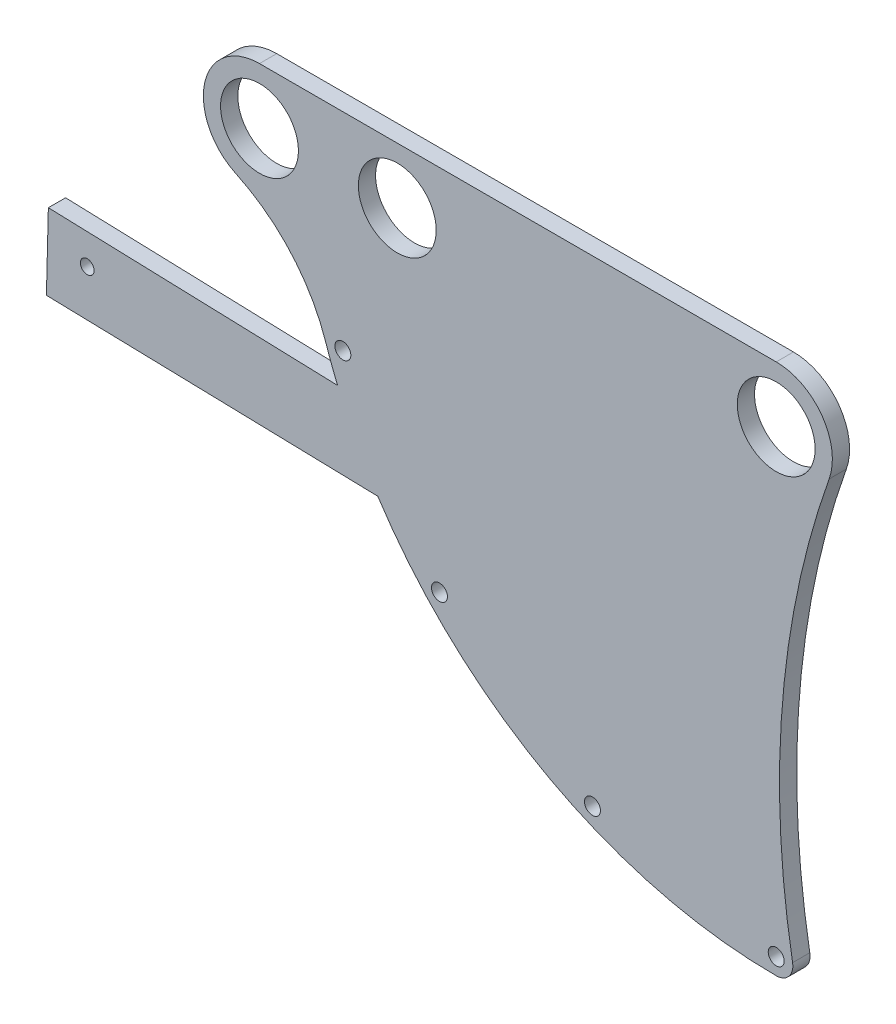
ISO-10303-21;
HEADER;
FILE_DESCRIPTION(('STEP AP214'),'2;1');
FILE_NAME('part.step','',(''),(''),'','','');
FILE_SCHEMA(('AUTOMOTIVE_DESIGN { 1 0 10303 214 1 1 1 1 }'));
ENDSEC;
DATA;
#1=APPLICATION_CONTEXT('core data for automotive mechanical design processes');
#2=APPLICATION_PROTOCOL_DEFINITION('international standard','automotive_design',2000,#1);
#3=PRODUCT_CONTEXT('',#1,'mechanical');
#4=PRODUCT('Part','Part','',(#3));
#5=PRODUCT_RELATED_PRODUCT_CATEGORY('part','',(#4));
#6=PRODUCT_DEFINITION_FORMATION('','',#4);
#7=PRODUCT_DEFINITION_CONTEXT('part definition',#1,'design');
#8=PRODUCT_DEFINITION('design','',#6,#7);
#9=PRODUCT_DEFINITION_SHAPE('','',#8);
#10=(LENGTH_UNIT() NAMED_UNIT(*) SI_UNIT(.MILLI.,.METRE.));
#11=(NAMED_UNIT(*) PLANE_ANGLE_UNIT() SI_UNIT($,.RADIAN.));
#12=(NAMED_UNIT(*) SI_UNIT($,.STERADIAN.) SOLID_ANGLE_UNIT());
#13=UNCERTAINTY_MEASURE_WITH_UNIT(LENGTH_MEASURE(1.E-05),#10,'distance_accuracy_value','');
#14=(GEOMETRIC_REPRESENTATION_CONTEXT(3) GLOBAL_UNCERTAINTY_ASSIGNED_CONTEXT((#13)) GLOBAL_UNIT_ASSIGNED_CONTEXT((#10,
#11,#12)) REPRESENTATION_CONTEXT('',''));
#15=CARTESIAN_POINT('',(0.,0.,0.));
#16=DIRECTION('',(0.,0.,1.));
#17=DIRECTION('',(1.,0.,0.));
#18=AXIS2_PLACEMENT_3D('',#15,#16,#17);
#19=CARTESIAN_POINT('',(254.,190.196999902,0.));
#20=DIRECTION('',(0.,0.,1.));
#21=DIRECTION('',(1.,0.,0.));
#22=AXIS2_PLACEMENT_3D('',#19,#20,#21);
#23=CYLINDRICAL_SURFACE('',#22,175.2854);
#24=CARTESIAN_POINT('',(254.,190.196999902,6.35));
#25=DIRECTION('',(0.,0.,1.));
#26=DIRECTION('',(-1.,0.,0.));
#27=AXIS2_PLACEMENT_3D('',#24,#25,#26);
#28=CIRCLE('',#27,175.2854);
#29=CARTESIAN_POINT('',(107.107329860614,94.554358196108,6.35));
#30=VERTEX_POINT('',#29);
#31=CARTESIAN_POINT('',(254.,14.9115999020001,6.35));
#32=VERTEX_POINT('',#31);
#33=EDGE_CURVE('E79',#30,#32,#28,.T.);
#34=ORIENTED_EDGE('',*,*,#33,.F.);
#35=DIRECTION('',(0.,0.,-1.));
#36=VECTOR('',#35,1.);
#37=CARTESIAN_POINT('',(107.107329860614,94.554358196108,6.35));
#38=LINE('',#37,#36);
#39=CARTESIAN_POINT('',(107.107329860614,94.554358196108,0.));
#40=VERTEX_POINT('',#39);
#41=EDGE_CURVE('E181',#30,#40,#38,.T.);
#42=ORIENTED_EDGE('',*,*,#41,.T.);
#43=CARTESIAN_POINT('',(254.,190.196999902,0.));
#44=DIRECTION('',(0.,0.,1.));
#45=DIRECTION('',(-1.,0.,0.));
#46=AXIS2_PLACEMENT_3D('',#43,#44,#45);
#47=CIRCLE('',#46,175.2854);
#48=CARTESIAN_POINT('',(254.,14.9115999020001,0.));
#49=VERTEX_POINT('',#48);
#50=EDGE_CURVE('E186',#40,#49,#47,.T.);
#51=ORIENTED_EDGE('',*,*,#50,.T.);
#52=DIRECTION('',(0.,0.,1.));
#53=VECTOR('',#52,1.);
#54=CARTESIAN_POINT('',(254.,14.9115999020001,0.));
#55=LINE('',#54,#53);
#56=EDGE_CURVE('E231',#49,#32,#55,.T.);
#57=ORIENTED_EDGE('',*,*,#56,.T.);
#58=EDGE_LOOP('',(#34,#42,#51,#57));
#59=FACE_BOUND('',#58,.T.);
#60=ADVANCED_FACE('F56',(#59),#23,.T.);
#61=CARTESIAN_POINT('',(0.,0.,6.35));
#62=DIRECTION('',(0.,0.,1.));
#63=DIRECTION('',(1.,0.,0.));
#64=AXIS2_PLACEMENT_3D('',#61,#62,#63);
#65=PLANE('',#64);
#66=CARTESIAN_POINT('',(114.3,190.196999902,6.35));
#67=DIRECTION('',(0.,0.,1.));
#68=DIRECTION('',(1.,0.,0.));
#69=AXIS2_PLACEMENT_3D('',#66,#67,#68);
#70=CIRCLE('',#69,14.351);
#71=CARTESIAN_POINT('',(128.651,190.196999902,6.35));
#72=VERTEX_POINT('',#71);
#73=EDGE_CURVE('E234',#72,#72,#70,.T.);
#74=ORIENTED_EDGE('',*,*,#73,.F.);
#75=EDGE_LOOP('',(#74));
#76=FACE_BOUND('',#75,.T.);
#77=CARTESIAN_POINT('',(63.5,190.196999902,6.35));
#78=DIRECTION('',(0.,0.,1.));
#79=DIRECTION('',(1.,0.,0.));
#80=AXIS2_PLACEMENT_3D('',#77,#78,#79);
#81=CIRCLE('',#80,14.351);
#82=CARTESIAN_POINT('',(77.851,190.196999902,6.35));
#83=VERTEX_POINT('',#82);
#84=EDGE_CURVE('E246',#83,#83,#81,.T.);
#85=ORIENTED_EDGE('',*,*,#84,.F.);
#86=EDGE_LOOP('',(#85));
#87=FACE_BOUND('',#86,.T.);
#88=CARTESIAN_POINT('',(186.255842738499,35.1899418274433,6.35));
#89=DIRECTION('',(0.,0.,1.));
#90=DIRECTION('',(1.,0.,0.));
#91=AXIS2_PLACEMENT_3D('',#88,#89,#90);
#92=CIRCLE('',#91,2.9464);
#93=CARTESIAN_POINT('',(189.202242738499,35.1899418274433,6.35));
#94=VERTEX_POINT('',#93);
#95=EDGE_CURVE('E258',#94,#94,#92,.T.);
#96=ORIENTED_EDGE('',*,*,#95,.F.);
#97=EDGE_LOOP('',(#96));
#98=FACE_BOUND('',#97,.T.);
#99=CARTESIAN_POINT('',(254.,190.196999902,6.35));
#100=DIRECTION('',(0.,0.,1.));
#101=DIRECTION('',(1.,0.,0.));
#102=AXIS2_PLACEMENT_3D('',#99,#100,#101);
#103=CIRCLE('',#102,14.351);
#104=CARTESIAN_POINT('',(268.351,190.196999902,6.35));
#105=VERTEX_POINT('',#104);
#106=EDGE_CURVE('E12',#105,#105,#103,.T.);
#107=ORIENTED_EDGE('',*,*,#106,.F.);
#108=EDGE_LOOP('',(#107));
#109=FACE_BOUND('',#108,.T.);
#110=CARTESIAN_POINT('',(254.,21.0329999020001,6.35));
#111=DIRECTION('',(0.,0.,1.));
#112=DIRECTION('',(1.,0.,0.));
#113=AXIS2_PLACEMENT_3D('',#110,#111,#112);
#114=CIRCLE('',#113,2.9464);
#115=CARTESIAN_POINT('',(256.9464,21.0329999020001,6.35));
#116=VERTEX_POINT('',#115);
#117=EDGE_CURVE('E264',#116,#116,#114,.T.);
#118=ORIENTED_EDGE('',*,*,#117,.F.);
#119=EDGE_LOOP('',(#118));
#120=FACE_BOUND('',#119,.T.);
#121=CARTESIAN_POINT('',(129.850387566558,75.2912444820644,6.35));
#122=DIRECTION('',(0.,0.,1.));
#123=DIRECTION('',(1.,0.,0.));
#124=AXIS2_PLACEMENT_3D('',#121,#122,#123);
#125=CIRCLE('',#124,2.9464);
#126=CARTESIAN_POINT('',(132.796787566558,75.2912444820644,6.35));
#127=VERTEX_POINT('',#126);
#128=EDGE_CURVE('E252',#127,#127,#125,.T.);
#129=ORIENTED_EDGE('',*,*,#128,.F.);
#130=EDGE_LOOP('',(#129));
#131=FACE_BOUND('',#130,.T.);
#132=CARTESIAN_POINT('',(94.2245173333334,134.624938264576,6.35));
#133=DIRECTION('',(0.,0.,1.));
#134=DIRECTION('',(1.,0.,0.));
#135=AXIS2_PLACEMENT_3D('',#132,#133,#134);
#136=CIRCLE('',#135,2.9464);
#137=CARTESIAN_POINT('',(97.1709173333334,134.624938264576,6.35));
#138=VERTEX_POINT('',#137);
#139=EDGE_CURVE('E240',#138,#138,#136,.T.);
#140=ORIENTED_EDGE('',*,*,#139,.F.);
#141=EDGE_LOOP('',(#140));
#142=FACE_BOUND('',#141,.T.);
#143=CARTESIAN_POINT('',(63.5,190.196999902,6.35));
#144=DIRECTION('',(0.,0.,1.));
#145=DIRECTION('',(1.,0.,0.));
#146=AXIS2_PLACEMENT_3D('',#143,#144,#145);
#147=CIRCLE('',#146,20.701);
#148=CARTESIAN_POINT('',(63.5,210.897999902,6.35));
#149=VERTEX_POINT('',#148);
#150=CARTESIAN_POINT('',(54.6993893861036,171.459853539158,6.35));
#151=VERTEX_POINT('',#150);
#152=EDGE_CURVE('E187',#149,#151,#147,.T.);
#153=ORIENTED_EDGE('',*,*,#152,.T.);
#154=CARTESIAN_POINT('',(27.7036513066667,113.983944450685,6.35));
#155=DIRECTION('',(0.,0.,-1.));
#156=DIRECTION('',(-1.,0.,0.));
#157=AXIS2_PLACEMENT_3D('',#154,#155,#156);
#158=CIRCLE('',#157,63.5);
#159=CARTESIAN_POINT('',(87.8824484275404,134.251217999061,6.35));
#160=VERTEX_POINT('',#159);
#161=EDGE_CURVE('E183',#151,#160,#158,.T.);
#162=ORIENTED_EDGE('',*,*,#161,.T.);
#163=CARTESIAN_POINT('',(92.3007563113324,122.533671254402,6.35));
#164=VERTEX_POINT('',#163);
#165=EDGE_CURVE('E166',#160,#164,#28,.T.);
#166=ORIENTED_EDGE('',*,*,#165,.T.);
#167=DIRECTION('',(0.999484096195771,-0.0321176190232658,0.));
#168=VECTOR('',#167,1.);
#169=CARTESIAN_POINT('',(-14.3413322070149,125.960529154307,6.35));
#170=LINE('',#169,#168);
#171=CARTESIAN_POINT('',(-14.3413322070149,125.960529154307,6.35));
#172=VERTEX_POINT('',#171);
#173=EDGE_CURVE('E145',#172,#164,#170,.T.);
#174=ORIENTED_EDGE('',*,*,#173,.F.);
#175=DIRECTION('',(-0.025167567309592,-0.999683246611504,0.));
#176=VECTOR('',#175,1.);
#177=CARTESIAN_POINT('',(-14.3413322070149,125.960529154307,6.35));
#178=LINE('',#177,#176);
#179=CARTESIAN_POINT('',(-15.0545723961005,97.6298502663563,6.35));
#180=VERTEX_POINT('',#179);
#181=EDGE_CURVE('E154',#172,#180,#178,.T.);
#182=ORIENTED_EDGE('',*,*,#181,.T.);
#183=DIRECTION('',(0.999683246611504,-0.0251675673095923,0.));
#184=VECTOR('',#183,1.);
#185=CARTESIAN_POINT('',(-15.0545723961005,97.6298502663563,6.35));
#186=LINE('',#185,#184);
#187=EDGE_CURVE('E167',#180,#30,#186,.T.);
#188=ORIENTED_EDGE('',*,*,#187,.T.);
#189=ORIENTED_EDGE('',*,*,#33,.T.);
#190=CARTESIAN_POINT('',(254.,21.0329999020001,6.35));
#191=DIRECTION('',(0.,0.,1.));
#192=DIRECTION('',(1.,0.,0.));
#193=AXIS2_PLACEMENT_3D('',#190,#191,#192);
#194=CIRCLE('',#193,6.12140000000004);
#195=CARTESIAN_POINT('',(260.028402179289,22.0959698567705,6.35));
#196=VERTEX_POINT('',#195);
#197=EDGE_CURVE('E207',#32,#196,#194,.T.);
#198=ORIENTED_EDGE('',*,*,#197,.T.);
#199=CARTESIAN_POINT('',(572.196073317689,77.1395527834045,6.35));
#200=DIRECTION('',(0.,0.,-1.));
#201=DIRECTION('',(1.,0.,0.));
#202=AXIS2_PLACEMENT_3D('',#199,#200,#201);
#203=CIRCLE('',#202,316.98336064433);
#204=CARTESIAN_POINT('',(273.506313236364,183.266260769349,6.35));
#205=VERTEX_POINT('',#204);
#206=EDGE_CURVE('E210',#196,#205,#203,.T.);
#207=ORIENTED_EDGE('',*,*,#206,.T.);
#208=CARTESIAN_POINT('',(254.,190.196999902,6.35));
#209=DIRECTION('',(0.,0.,1.));
#210=DIRECTION('',(1.,0.,0.));
#211=AXIS2_PLACEMENT_3D('',#208,#209,#210);
#212=CIRCLE('',#211,20.7010000000001);
#213=CARTESIAN_POINT('',(254.,210.897999902,6.35));
#214=VERTEX_POINT('',#213);
#215=EDGE_CURVE('E213',#205,#214,#212,.T.);
#216=ORIENTED_EDGE('',*,*,#215,.T.);
#217=DIRECTION('',(-1.,0.,0.));
#218=VECTOR('',#217,1.);
#219=CARTESIAN_POINT('',(63.5,210.897999902,6.35));
#220=LINE('',#219,#218);
#221=EDGE_CURVE('E216',#214,#149,#220,.T.);
#222=ORIENTED_EDGE('',*,*,#221,.T.);
#223=EDGE_LOOP('',(#153,#162,#166,#174,#182,#188,#189,#198,#207,#216,#222));
#224=FACE_BOUND('',#223,.T.);
#225=CARTESIAN_POINT('',(0.,114.3,6.35));
#226=DIRECTION('',(0.,0.,-1.));
#227=DIRECTION('',(-1.,0.,0.));
#228=AXIS2_PLACEMENT_3D('',#225,#226,#227);
#229=CIRCLE('',#228,2.54);
#230=CARTESIAN_POINT('',(-2.54,114.3,6.35));
#231=VERTEX_POINT('',#230);
#232=EDGE_CURVE('E176',#231,#231,#229,.T.);
#233=ORIENTED_EDGE('',*,*,#232,.T.);
#234=EDGE_LOOP('',(#233));
#235=FACE_BOUND('',#234,.T.);
#236=ADVANCED_FACE('F162',(#76,#87,#98,#109,#120,#131,#142,#224,#235),#65,.T.);
#237=CARTESIAN_POINT('',(0.,0.,0.));
#238=DIRECTION('',(0.,0.,1.));
#239=DIRECTION('',(1.,0.,0.));
#240=AXIS2_PLACEMENT_3D('',#237,#238,#239);
#241=PLANE('',#240);
#242=CARTESIAN_POINT('',(114.3,190.196999902,0.));
#243=DIRECTION('',(0.,0.,1.));
#244=DIRECTION('',(1.,0.,0.));
#245=AXIS2_PLACEMENT_3D('',#242,#243,#244);
#246=CIRCLE('',#245,14.351);
#247=CARTESIAN_POINT('',(128.651,190.196999902,0.));
#248=VERTEX_POINT('',#247);
#249=EDGE_CURVE('E222',#248,#248,#246,.T.);
#250=ORIENTED_EDGE('',*,*,#249,.T.);
#251=EDGE_LOOP('',(#250));
#252=FACE_BOUND('',#251,.T.);
#253=CARTESIAN_POINT('',(94.2245173333334,134.624938264576,0.));
#254=DIRECTION('',(0.,0.,1.));
#255=DIRECTION('',(1.,0.,0.));
#256=AXIS2_PLACEMENT_3D('',#253,#254,#255);
#257=CIRCLE('',#256,2.9464);
#258=CARTESIAN_POINT('',(97.1709173333334,134.624938264576,0.));
#259=VERTEX_POINT('',#258);
#260=EDGE_CURVE('E237',#259,#259,#257,.T.);
#261=ORIENTED_EDGE('',*,*,#260,.T.);
#262=EDGE_LOOP('',(#261));
#263=FACE_BOUND('',#262,.T.);
#264=CARTESIAN_POINT('',(63.5,190.196999902,0.));
#265=DIRECTION('',(0.,0.,1.));
#266=DIRECTION('',(1.,0.,0.));
#267=AXIS2_PLACEMENT_3D('',#264,#265,#266);
#268=CIRCLE('',#267,14.351);
#269=CARTESIAN_POINT('',(77.851,190.196999902,0.));
#270=VERTEX_POINT('',#269);
#271=EDGE_CURVE('E243',#270,#270,#268,.T.);
#272=ORIENTED_EDGE('',*,*,#271,.T.);
#273=EDGE_LOOP('',(#272));
#274=FACE_BOUND('',#273,.T.);
#275=CARTESIAN_POINT('',(129.850387566558,75.2912444820644,0.));
#276=DIRECTION('',(0.,0.,1.));
#277=DIRECTION('',(1.,0.,0.));
#278=AXIS2_PLACEMENT_3D('',#275,#276,#277);
#279=CIRCLE('',#278,2.9464);
#280=CARTESIAN_POINT('',(132.796787566558,75.2912444820644,0.));
#281=VERTEX_POINT('',#280);
#282=EDGE_CURVE('E249',#281,#281,#279,.T.);
#283=ORIENTED_EDGE('',*,*,#282,.T.);
#284=EDGE_LOOP('',(#283));
#285=FACE_BOUND('',#284,.T.);
#286=CARTESIAN_POINT('',(186.255842738499,35.1899418274433,0.));
#287=DIRECTION('',(0.,0.,1.));
#288=DIRECTION('',(1.,0.,0.));
#289=AXIS2_PLACEMENT_3D('',#286,#287,#288);
#290=CIRCLE('',#289,2.9464);
#291=CARTESIAN_POINT('',(189.202242738499,35.1899418274433,0.));
#292=VERTEX_POINT('',#291);
#293=EDGE_CURVE('E255',#292,#292,#290,.T.);
#294=ORIENTED_EDGE('',*,*,#293,.T.);
#295=EDGE_LOOP('',(#294));
#296=FACE_BOUND('',#295,.T.);
#297=CARTESIAN_POINT('',(254.,21.0329999020001,0.));
#298=DIRECTION('',(0.,0.,1.));
#299=DIRECTION('',(1.,0.,0.));
#300=AXIS2_PLACEMENT_3D('',#297,#298,#299);
#301=CIRCLE('',#300,2.9464);
#302=CARTESIAN_POINT('',(256.9464,21.0329999020001,0.));
#303=VERTEX_POINT('',#302);
#304=EDGE_CURVE('E261',#303,#303,#301,.T.);
#305=ORIENTED_EDGE('',*,*,#304,.T.);
#306=EDGE_LOOP('',(#305));
#307=FACE_BOUND('',#306,.T.);
#308=CARTESIAN_POINT('',(254.,190.196999902,0.));
#309=DIRECTION('',(0.,0.,1.));
#310=DIRECTION('',(1.,0.,0.));
#311=AXIS2_PLACEMENT_3D('',#308,#309,#310);
#312=CIRCLE('',#311,14.351);
#313=CARTESIAN_POINT('',(268.351,190.196999902,0.));
#314=VERTEX_POINT('',#313);
#315=EDGE_CURVE('E60',#314,#314,#312,.T.);
#316=ORIENTED_EDGE('',*,*,#315,.T.);
#317=EDGE_LOOP('',(#316));
#318=FACE_BOUND('',#317,.T.);
#319=CARTESIAN_POINT('',(27.7036513066667,113.983944450685,0.));
#320=DIRECTION('',(0.,0.,-1.));
#321=DIRECTION('',(-1.,0.,0.));
#322=AXIS2_PLACEMENT_3D('',#319,#320,#321);
#323=CIRCLE('',#322,63.5);
#324=CARTESIAN_POINT('',(54.6993893861036,171.459853539158,0.));
#325=VERTEX_POINT('',#324);
#326=CARTESIAN_POINT('',(87.8824484275404,134.251217999061,0.));
#327=VERTEX_POINT('',#326);
#328=EDGE_CURVE('E184',#325,#327,#323,.T.);
#329=ORIENTED_EDGE('',*,*,#328,.F.);
#330=CARTESIAN_POINT('',(63.5,190.196999902,0.));
#331=DIRECTION('',(0.,0.,1.));
#332=DIRECTION('',(1.,0.,0.));
#333=AXIS2_PLACEMENT_3D('',#330,#331,#332);
#334=CIRCLE('',#333,20.701);
#335=CARTESIAN_POINT('',(63.5,210.897999902,0.));
#336=VERTEX_POINT('',#335);
#337=EDGE_CURVE('E201',#336,#325,#334,.T.);
#338=ORIENTED_EDGE('',*,*,#337,.F.);
#339=DIRECTION('',(-1.,0.,0.));
#340=VECTOR('',#339,1.);
#341=CARTESIAN_POINT('',(63.5,210.897999902,0.));
#342=LINE('',#341,#340);
#343=CARTESIAN_POINT('',(254.,210.897999902,0.));
#344=VERTEX_POINT('',#343);
#345=EDGE_CURVE('E198',#344,#336,#342,.T.);
#346=ORIENTED_EDGE('',*,*,#345,.F.);
#347=CARTESIAN_POINT('',(254.,190.196999902,0.));
#348=DIRECTION('',(0.,0.,1.));
#349=DIRECTION('',(1.,0.,0.));
#350=AXIS2_PLACEMENT_3D('',#347,#348,#349);
#351=CIRCLE('',#350,20.7010000000001);
#352=CARTESIAN_POINT('',(273.506313236364,183.266260769349,0.));
#353=VERTEX_POINT('',#352);
#354=EDGE_CURVE('E195',#353,#344,#351,.T.);
#355=ORIENTED_EDGE('',*,*,#354,.F.);
#356=CARTESIAN_POINT('',(572.196073317689,77.1395527834045,0.));
#357=DIRECTION('',(0.,0.,-1.));
#358=DIRECTION('',(1.,0.,0.));
#359=AXIS2_PLACEMENT_3D('',#356,#357,#358);
#360=CIRCLE('',#359,316.98336064433);
#361=CARTESIAN_POINT('',(260.028402179289,22.0959698567705,0.));
#362=VERTEX_POINT('',#361);
#363=EDGE_CURVE('E192',#362,#353,#360,.T.);
#364=ORIENTED_EDGE('',*,*,#363,.F.);
#365=CARTESIAN_POINT('',(254.,21.0329999020001,0.));
#366=DIRECTION('',(0.,0.,1.));
#367=DIRECTION('',(1.,0.,0.));
#368=AXIS2_PLACEMENT_3D('',#365,#366,#367);
#369=CIRCLE('',#368,6.12140000000004);
#370=EDGE_CURVE('E189',#49,#362,#369,.T.);
#371=ORIENTED_EDGE('',*,*,#370,.F.);
#372=ORIENTED_EDGE('',*,*,#50,.F.);
#373=DIRECTION('',(0.999683246611504,-0.0251675673095923,0.));
#374=VECTOR('',#373,1.);
#375=CARTESIAN_POINT('',(-15.0545723961005,97.6298502663563,0.));
#376=LINE('',#375,#374);
#377=CARTESIAN_POINT('',(-15.0545723961005,97.6298502663563,0.));
#378=VERTEX_POINT('',#377);
#379=EDGE_CURVE('E173',#378,#40,#376,.T.);
#380=ORIENTED_EDGE('',*,*,#379,.F.);
#381=DIRECTION('',(-0.025167567309592,-0.999683246611504,0.));
#382=VECTOR('',#381,1.);
#383=CARTESIAN_POINT('',(-14.3413322070149,125.960529154307,0.));
#384=LINE('',#383,#382);
#385=CARTESIAN_POINT('',(-14.3413322070149,125.960529154307,0.));
#386=VERTEX_POINT('',#385);
#387=EDGE_CURVE('E169',#386,#378,#384,.T.);
#388=ORIENTED_EDGE('',*,*,#387,.F.);
#389=DIRECTION('',(0.999484096195771,-0.0321176190232658,0.));
#390=VECTOR('',#389,1.);
#391=CARTESIAN_POINT('',(-14.3413322070149,125.960529154307,0.));
#392=LINE('',#391,#390);
#393=CARTESIAN_POINT('',(92.3007563113324,122.533671254402,0.));
#394=VERTEX_POINT('',#393);
#395=EDGE_CURVE('E147',#386,#394,#392,.T.);
#396=ORIENTED_EDGE('',*,*,#395,.T.);
#397=EDGE_CURVE('E71',#327,#394,#47,.T.);
#398=ORIENTED_EDGE('',*,*,#397,.F.);
#399=EDGE_LOOP('',(#329,#338,#346,#355,#364,#371,#372,#380,#388,#396,#398));
#400=FACE_BOUND('',#399,.T.);
#401=CARTESIAN_POINT('',(0.,114.3,0.));
#402=DIRECTION('',(0.,0.,-1.));
#403=DIRECTION('',(-1.,0.,0.));
#404=AXIS2_PLACEMENT_3D('',#401,#402,#403);
#405=CIRCLE('',#404,2.54);
#406=CARTESIAN_POINT('',(-2.54,114.3,0.));
#407=VERTEX_POINT('',#406);
#408=EDGE_CURVE('E505',#407,#407,#405,.T.);
#409=ORIENTED_EDGE('',*,*,#408,.F.);
#410=EDGE_LOOP('',(#409));
#411=FACE_BOUND('',#410,.T.);
#412=ADVANCED_FACE('F58',(#252,#263,#274,#285,#296,#307,#318,#400,#411),#241,.F.);
#413=CARTESIAN_POINT('',(254.,190.196999902,6.35));
#414=DIRECTION('',(0.,0.,-1.));
#415=DIRECTION('',(-1.,0.,0.));
#416=AXIS2_PLACEMENT_3D('',#413,#414,#415);
#417=CYLINDRICAL_SURFACE('',#416,14.351);
#418=ORIENTED_EDGE('',*,*,#106,.T.);
#419=EDGE_LOOP('',(#418));
#420=FACE_BOUND('',#419,.T.);
#421=ORIENTED_EDGE('',*,*,#315,.F.);
#422=EDGE_LOOP('',(#421));
#423=FACE_BOUND('',#422,.T.);
#424=ADVANCED_FACE('F275',(#420,#423),#417,.F.);
#425=CARTESIAN_POINT('',(254.,21.0329999020001,6.35));
#426=DIRECTION('',(0.,0.,-1.));
#427=DIRECTION('',(-1.,0.,0.));
#428=AXIS2_PLACEMENT_3D('',#425,#426,#427);
#429=CYLINDRICAL_SURFACE('',#428,2.9464);
#430=ORIENTED_EDGE('',*,*,#117,.T.);
#431=EDGE_LOOP('',(#430));
#432=FACE_BOUND('',#431,.T.);
#433=ORIENTED_EDGE('',*,*,#304,.F.);
#434=EDGE_LOOP('',(#433));
#435=FACE_BOUND('',#434,.T.);
#436=ADVANCED_FACE('F272',(#432,#435),#429,.F.);
#437=CARTESIAN_POINT('',(186.255842738499,35.1899418274433,6.35));
#438=DIRECTION('',(0.,0.,-1.));
#439=DIRECTION('',(-1.,0.,0.));
#440=AXIS2_PLACEMENT_3D('',#437,#438,#439);
#441=CYLINDRICAL_SURFACE('',#440,2.9464);
#442=ORIENTED_EDGE('',*,*,#95,.T.);
#443=EDGE_LOOP('',(#442));
#444=FACE_BOUND('',#443,.T.);
#445=ORIENTED_EDGE('',*,*,#293,.F.);
#446=EDGE_LOOP('',(#445));
#447=FACE_BOUND('',#446,.T.);
#448=ADVANCED_FACE('F274',(#444,#447),#441,.F.);
#449=CARTESIAN_POINT('',(129.850387566558,75.2912444820644,6.35));
#450=DIRECTION('',(0.,0.,-1.));
#451=DIRECTION('',(-1.,0.,0.));
#452=AXIS2_PLACEMENT_3D('',#449,#450,#451);
#453=CYLINDRICAL_SURFACE('',#452,2.9464);
#454=ORIENTED_EDGE('',*,*,#128,.T.);
#455=EDGE_LOOP('',(#454));
#456=FACE_BOUND('',#455,.T.);
#457=ORIENTED_EDGE('',*,*,#282,.F.);
#458=EDGE_LOOP('',(#457));
#459=FACE_BOUND('',#458,.T.);
#460=ADVANCED_FACE('F282',(#456,#459),#453,.F.);
#461=CARTESIAN_POINT('',(63.5,190.196999902,6.35));
#462=DIRECTION('',(0.,0.,-1.));
#463=DIRECTION('',(-1.,0.,0.));
#464=AXIS2_PLACEMENT_3D('',#461,#462,#463);
#465=CYLINDRICAL_SURFACE('',#464,14.351);
#466=ORIENTED_EDGE('',*,*,#84,.T.);
#467=EDGE_LOOP('',(#466));
#468=FACE_BOUND('',#467,.T.);
#469=ORIENTED_EDGE('',*,*,#271,.F.);
#470=EDGE_LOOP('',(#469));
#471=FACE_BOUND('',#470,.T.);
#472=ADVANCED_FACE('F347',(#468,#471),#465,.F.);
#473=CARTESIAN_POINT('',(94.2245173333334,134.624938264576,6.35));
#474=DIRECTION('',(0.,0.,-1.));
#475=DIRECTION('',(-1.,0.,0.));
#476=AXIS2_PLACEMENT_3D('',#473,#474,#475);
#477=CYLINDRICAL_SURFACE('',#476,2.9464);
#478=ORIENTED_EDGE('',*,*,#139,.T.);
#479=EDGE_LOOP('',(#478));
#480=FACE_BOUND('',#479,.T.);
#481=ORIENTED_EDGE('',*,*,#260,.F.);
#482=EDGE_LOOP('',(#481));
#483=FACE_BOUND('',#482,.T.);
#484=ADVANCED_FACE('F341',(#480,#483),#477,.F.);
#485=CARTESIAN_POINT('',(114.3,190.196999902,6.35));
#486=DIRECTION('',(0.,0.,-1.));
#487=DIRECTION('',(-1.,0.,0.));
#488=AXIS2_PLACEMENT_3D('',#485,#486,#487);
#489=CYLINDRICAL_SURFACE('',#488,14.351);
#490=ORIENTED_EDGE('',*,*,#73,.T.);
#491=EDGE_LOOP('',(#490));
#492=FACE_BOUND('',#491,.T.);
#493=ORIENTED_EDGE('',*,*,#249,.F.);
#494=EDGE_LOOP('',(#493));
#495=FACE_BOUND('',#494,.T.);
#496=ADVANCED_FACE('F335',(#492,#495),#489,.F.);
#497=CARTESIAN_POINT('',(27.7036513066667,113.983944450685,0.));
#498=DIRECTION('',(0.,0.,1.));
#499=DIRECTION('',(1.,0.,0.));
#500=AXIS2_PLACEMENT_3D('',#497,#498,#499);
#501=CYLINDRICAL_SURFACE('',#500,63.5);
#502=ORIENTED_EDGE('',*,*,#161,.F.);
#503=DIRECTION('',(0.,0.,1.));
#504=VECTOR('',#503,1.);
#505=CARTESIAN_POINT('',(54.6993893861036,171.459853539158,0.));
#506=LINE('',#505,#504);
#507=EDGE_CURVE('E220',#325,#151,#506,.T.);
#508=ORIENTED_EDGE('',*,*,#507,.F.);
#509=ORIENTED_EDGE('',*,*,#328,.T.);
#510=DIRECTION('',(0.,0.,1.));
#511=VECTOR('',#510,1.);
#512=CARTESIAN_POINT('',(87.8824484275404,134.251217999061,0.));
#513=LINE('',#512,#511);
#514=EDGE_CURVE('E204',#327,#160,#513,.T.);
#515=ORIENTED_EDGE('',*,*,#514,.T.);
#516=EDGE_LOOP('',(#502,#508,#509,#515));
#517=FACE_BOUND('',#516,.T.);
#518=ADVANCED_FACE('F333',(#517),#501,.F.);
#519=CARTESIAN_POINT('',(63.5,190.196999902,0.));
#520=DIRECTION('',(0.,0.,1.));
#521=DIRECTION('',(1.,0.,0.));
#522=AXIS2_PLACEMENT_3D('',#519,#520,#521);
#523=CYLINDRICAL_SURFACE('',#522,20.701);
#524=ORIENTED_EDGE('',*,*,#152,.F.);
#525=DIRECTION('',(0.,0.,1.));
#526=VECTOR('',#525,1.);
#527=CARTESIAN_POINT('',(63.5,210.897999902,0.));
#528=LINE('',#527,#526);
#529=EDGE_CURVE('E223',#336,#149,#528,.T.);
#530=ORIENTED_EDGE('',*,*,#529,.F.);
#531=ORIENTED_EDGE('',*,*,#337,.T.);
#532=ORIENTED_EDGE('',*,*,#507,.T.);
#533=EDGE_LOOP('',(#524,#530,#531,#532));
#534=FACE_BOUND('',#533,.T.);
#535=ADVANCED_FACE('F330',(#534),#523,.T.);
#536=CARTESIAN_POINT('',(63.5,210.897999902,0.));
#537=DIRECTION('',(0.,1.,0.));
#538=DIRECTION('',(-1.,0.,0.));
#539=AXIS2_PLACEMENT_3D('',#536,#537,#538);
#540=PLANE('',#539);
#541=ORIENTED_EDGE('',*,*,#221,.F.);
#542=DIRECTION('',(0.,0.,1.));
#543=VECTOR('',#542,1.);
#544=CARTESIAN_POINT('',(254.,210.897999902,0.));
#545=LINE('',#544,#543);
#546=EDGE_CURVE('E225',#344,#214,#545,.T.);
#547=ORIENTED_EDGE('',*,*,#546,.F.);
#548=ORIENTED_EDGE('',*,*,#345,.T.);
#549=ORIENTED_EDGE('',*,*,#529,.T.);
#550=EDGE_LOOP('',(#541,#547,#548,#549));
#551=FACE_BOUND('',#550,.T.);
#552=ADVANCED_FACE('F326',(#551),#540,.T.);
#553=CARTESIAN_POINT('',(254.,190.196999902,0.));
#554=DIRECTION('',(0.,0.,1.));
#555=DIRECTION('',(1.,0.,0.));
#556=AXIS2_PLACEMENT_3D('',#553,#554,#555);
#557=CYLINDRICAL_SURFACE('',#556,20.7010000000001);
#558=ORIENTED_EDGE('',*,*,#215,.F.);
#559=DIRECTION('',(0.,0.,1.));
#560=VECTOR('',#559,1.);
#561=CARTESIAN_POINT('',(273.506313236364,183.266260769349,0.));
#562=LINE('',#561,#560);
#563=EDGE_CURVE('E227',#353,#205,#562,.T.);
#564=ORIENTED_EDGE('',*,*,#563,.F.);
#565=ORIENTED_EDGE('',*,*,#354,.T.);
#566=ORIENTED_EDGE('',*,*,#546,.T.);
#567=EDGE_LOOP('',(#558,#564,#565,#566));
#568=FACE_BOUND('',#567,.T.);
#569=ADVANCED_FACE('F324',(#568),#557,.T.);
#570=CARTESIAN_POINT('',(572.196073317689,77.1395527834045,0.));
#571=DIRECTION('',(0.,0.,1.));
#572=DIRECTION('',(1.,0.,0.));
#573=AXIS2_PLACEMENT_3D('',#570,#571,#572);
#574=CYLINDRICAL_SURFACE('',#573,316.98336064433);
#575=ORIENTED_EDGE('',*,*,#206,.F.);
#576=DIRECTION('',(0.,0.,1.));
#577=VECTOR('',#576,1.);
#578=CARTESIAN_POINT('',(260.028402179289,22.0959698567705,0.));
#579=LINE('',#578,#577);
#580=EDGE_CURVE('E229',#362,#196,#579,.T.);
#581=ORIENTED_EDGE('',*,*,#580,.F.);
#582=ORIENTED_EDGE('',*,*,#363,.T.);
#583=ORIENTED_EDGE('',*,*,#563,.T.);
#584=EDGE_LOOP('',(#575,#581,#582,#583));
#585=FACE_BOUND('',#584,.T.);
#586=ADVANCED_FACE('F306',(#585),#574,.F.);
#587=CARTESIAN_POINT('',(254.,21.0329999020001,0.));
#588=DIRECTION('',(0.,0.,1.));
#589=DIRECTION('',(1.,0.,0.));
#590=AXIS2_PLACEMENT_3D('',#587,#588,#589);
#591=CYLINDRICAL_SURFACE('',#590,6.12140000000004);
#592=ORIENTED_EDGE('',*,*,#197,.F.);
#593=ORIENTED_EDGE('',*,*,#56,.F.);
#594=ORIENTED_EDGE('',*,*,#370,.T.);
#595=ORIENTED_EDGE('',*,*,#580,.T.);
#596=EDGE_LOOP('',(#592,#593,#594,#595));
#597=FACE_BOUND('',#596,.T.);
#598=ADVANCED_FACE('F299',(#597),#591,.T.);
#599=DIRECTION('',(0.,0.,-1.));
#600=VECTOR('',#599,1.);
#601=CARTESIAN_POINT('',(92.3007563113324,122.533671254402,6.35));
#602=LINE('',#601,#600);
#603=EDGE_CURVE('E150',#164,#394,#602,.T.);
#604=ORIENTED_EDGE('',*,*,#603,.F.);
#605=ORIENTED_EDGE('',*,*,#165,.F.);
#606=ORIENTED_EDGE('',*,*,#514,.F.);
#607=ORIENTED_EDGE('',*,*,#397,.T.);
#608=EDGE_LOOP('',(#604,#605,#606,#607));
#609=FACE_BOUND('',#608,.T.);
#610=ADVANCED_FACE('F289',(#609),#23,.T.);
#611=CARTESIAN_POINT('',(-15.0545723961005,97.6298502663563,6.35));
#612=DIRECTION('',(0.0251675673095923,0.999683246611504,0.));
#613=DIRECTION('',(-0.999683246611504,0.0251675673095923,0.));
#614=AXIS2_PLACEMENT_3D('',#611,#612,#613);
#615=PLANE('',#614);
#616=ORIENTED_EDGE('',*,*,#379,.T.);
#617=ORIENTED_EDGE('',*,*,#41,.F.);
#618=ORIENTED_EDGE('',*,*,#187,.F.);
#619=DIRECTION('',(0.,0.,-1.));
#620=VECTOR('',#619,1.);
#621=CARTESIAN_POINT('',(-15.0545723961005,97.6298502663563,6.35));
#622=LINE('',#621,#620);
#623=EDGE_CURVE('E151',#180,#378,#622,.T.);
#624=ORIENTED_EDGE('',*,*,#623,.T.);
#625=EDGE_LOOP('',(#616,#617,#618,#624));
#626=FACE_BOUND('',#625,.T.);
#627=ADVANCED_FACE('F298',(#626),#615,.F.);
#628=CARTESIAN_POINT('',(-14.3413322070149,125.960529154307,6.35));
#629=DIRECTION('',(0.0321176190232658,0.999484096195771,0.));
#630=DIRECTION('',(-0.999484096195771,0.0321176190232658,0.));
#631=AXIS2_PLACEMENT_3D('',#628,#629,#630);
#632=PLANE('',#631);
#633=ORIENTED_EDGE('',*,*,#395,.F.);
#634=DIRECTION('',(0.,0.,-1.));
#635=VECTOR('',#634,1.);
#636=CARTESIAN_POINT('',(-14.3413322070149,125.960529154307,6.35));
#637=LINE('',#636,#635);
#638=EDGE_CURVE('E141',#172,#386,#637,.T.);
#639=ORIENTED_EDGE('',*,*,#638,.F.);
#640=ORIENTED_EDGE('',*,*,#173,.T.);
#641=ORIENTED_EDGE('',*,*,#603,.T.);
#642=EDGE_LOOP('',(#633,#639,#640,#641));
#643=FACE_BOUND('',#642,.T.);
#644=ADVANCED_FACE('F143',(#643),#632,.T.);
#645=CARTESIAN_POINT('',(-14.3413322070149,125.960529154307,6.35));
#646=DIRECTION('',(0.999683246611504,-0.025167567309592,0.));
#647=DIRECTION('',(0.025167567309592,0.999683246611504,0.));
#648=AXIS2_PLACEMENT_3D('',#645,#646,#647);
#649=PLANE('',#648);
#650=ORIENTED_EDGE('',*,*,#387,.T.);
#651=ORIENTED_EDGE('',*,*,#623,.F.);
#652=ORIENTED_EDGE('',*,*,#181,.F.);
#653=ORIENTED_EDGE('',*,*,#638,.T.);
#654=EDGE_LOOP('',(#650,#651,#652,#653));
#655=FACE_BOUND('',#654,.T.);
#656=ADVANCED_FACE('F155',(#655),#649,.F.);
#657=CARTESIAN_POINT('',(0.,114.3,6.35));
#658=DIRECTION('',(0.,0.,-1.));
#659=DIRECTION('',(-1.,0.,0.));
#660=AXIS2_PLACEMENT_3D('',#657,#658,#659);
#661=CYLINDRICAL_SURFACE('',#660,2.54);
#662=ORIENTED_EDGE('',*,*,#232,.F.);
#663=EDGE_LOOP('',(#662));
#664=FACE_BOUND('',#663,.T.);
#665=ORIENTED_EDGE('',*,*,#408,.T.);
#666=EDGE_LOOP('',(#665));
#667=FACE_BOUND('',#666,.T.);
#668=ADVANCED_FACE('F495',(#664,#667),#661,.F.);
#669=CLOSED_SHELL('',(#60,#236,#412,#424,#436,#448,#460,#472,#484,#496,#518,#535,#552,#569,#586,
#598,#610,#627,#644,#656,#668));
#670=MANIFOLD_SOLID_BREP('B2',#669);
#671=ADVANCED_BREP_SHAPE_REPRESENTATION('',(#18,#670),#14);
#672=SHAPE_DEFINITION_REPRESENTATION(#9,#671);
ENDSEC;
END-ISO-10303-21;
